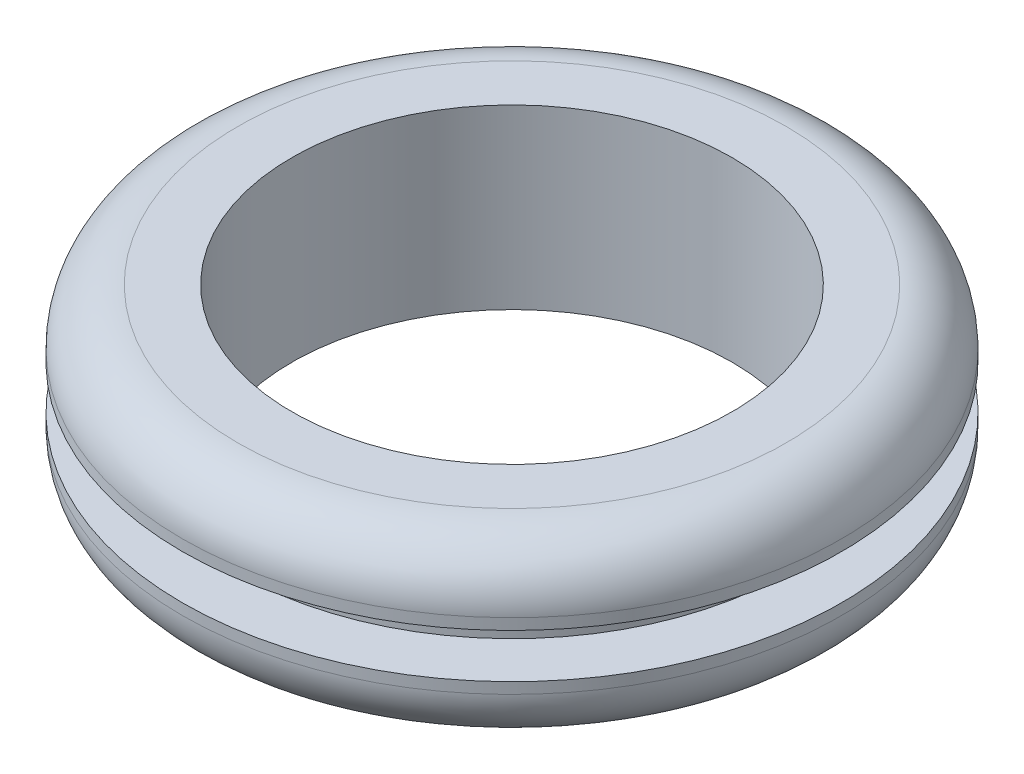
ISO-10303-21;
HEADER;
FILE_DESCRIPTION(('STEP AP214'),'2;1');
FILE_NAME('part.step','',(''),(''),'','','');
FILE_SCHEMA(('AUTOMOTIVE_DESIGN { 1 0 10303 214 1 1 1 1 }'));
ENDSEC;
DATA;
#1=APPLICATION_CONTEXT('core data for automotive mechanical design processes');
#2=APPLICATION_PROTOCOL_DEFINITION('international standard','automotive_design',2000,#1);
#3=PRODUCT_CONTEXT('',#1,'mechanical');
#4=PRODUCT('Part','Part','',(#3));
#5=PRODUCT_RELATED_PRODUCT_CATEGORY('part','',(#4));
#6=PRODUCT_DEFINITION_FORMATION('','',#4);
#7=PRODUCT_DEFINITION_CONTEXT('part definition',#1,'design');
#8=PRODUCT_DEFINITION('design','',#6,#7);
#9=PRODUCT_DEFINITION_SHAPE('','',#8);
#10=(LENGTH_UNIT() NAMED_UNIT(*) SI_UNIT(.MILLI.,.METRE.));
#11=(NAMED_UNIT(*) PLANE_ANGLE_UNIT() SI_UNIT($,.RADIAN.));
#12=(NAMED_UNIT(*) SI_UNIT($,.STERADIAN.) SOLID_ANGLE_UNIT());
#13=UNCERTAINTY_MEASURE_WITH_UNIT(LENGTH_MEASURE(1.E-05),#10,'distance_accuracy_value','');
#14=(GEOMETRIC_REPRESENTATION_CONTEXT(3) GLOBAL_UNCERTAINTY_ASSIGNED_CONTEXT((#13)) GLOBAL_UNIT_ASSIGNED_CONTEXT((#10,
#11,#12)) REPRESENTATION_CONTEXT('',''));
#15=CARTESIAN_POINT('',(0.,0.,0.));
#16=DIRECTION('',(0.,0.,1.));
#17=DIRECTION('',(1.,0.,0.));
#18=AXIS2_PLACEMENT_3D('',#15,#16,#17);
#19=CARTESIAN_POINT('',(9.89999999999999,3.2,0.));
#20=DIRECTION('',(0.,1.,0.));
#21=DIRECTION('',(0.,0.,1.));
#22=AXIS2_PLACEMENT_3D('',#19,#20,#21);
#23=PLANE('',#22);
#24=CARTESIAN_POINT('',(0.,3.2,0.));
#25=DIRECTION('',(0.,-1.,0.));
#26=DIRECTION('',(0.,0.,-1.));
#27=AXIS2_PLACEMENT_3D('',#24,#25,#26);
#28=CIRCLE('',#27,7.95);
#29=CARTESIAN_POINT('',(0.,3.2,-7.95));
#30=VERTEX_POINT('',#29);
#31=EDGE_CURVE('E10',#30,#30,#28,.T.);
#32=ORIENTED_EDGE('',*,*,#31,.T.);
#33=EDGE_LOOP('',(#32));
#34=FACE_BOUND('',#33,.T.);
#35=CARTESIAN_POINT('',(0.,3.2,0.));
#36=DIRECTION('',(0.,-1.,0.));
#37=DIRECTION('',(0.,0.,-1.));
#38=AXIS2_PLACEMENT_3D('',#35,#36,#37);
#39=CIRCLE('',#38,9.89999999999999);
#40=CARTESIAN_POINT('',(0.,3.2,-9.89999999999999));
#41=VERTEX_POINT('',#40);
#42=EDGE_CURVE('E50',#41,#41,#39,.T.);
#43=ORIENTED_EDGE('',*,*,#42,.F.);
#44=EDGE_LOOP('',(#43));
#45=FACE_BOUND('',#44,.T.);
#46=ADVANCED_FACE('F31',(#34,#45),#23,.T.);
#47=CARTESIAN_POINT('',(0.,0.,0.));
#48=DIRECTION('',(0.,-1.,0.));
#49=DIRECTION('',(0.,0.,-1.));
#50=AXIS2_PLACEMENT_3D('',#47,#48,#49);
#51=CYLINDRICAL_SURFACE('',#50,7.95);
#52=ORIENTED_EDGE('',*,*,#31,.F.);
#53=EDGE_LOOP('',(#52));
#54=FACE_BOUND('',#53,.T.);
#55=CARTESIAN_POINT('',(0.,-3.2,0.));
#56=DIRECTION('',(0.,-1.,0.));
#57=DIRECTION('',(0.,0.,-1.));
#58=AXIS2_PLACEMENT_3D('',#55,#56,#57);
#59=CIRCLE('',#58,7.95);
#60=CARTESIAN_POINT('',(0.,-3.2,-7.95));
#61=VERTEX_POINT('',#60);
#62=EDGE_CURVE('E53',#61,#61,#59,.T.);
#63=ORIENTED_EDGE('',*,*,#62,.T.);
#64=EDGE_LOOP('',(#63));
#65=FACE_BOUND('',#64,.T.);
#66=ADVANCED_FACE('F92',(#54,#65),#51,.F.);
#67=CARTESIAN_POINT('',(0.,0.,0.));
#68=DIRECTION('',(0.,-1.,0.));
#69=DIRECTION('',(0.,0.,-1.));
#70=AXIS2_PLACEMENT_3D('',#67,#68,#69);
#71=CYLINDRICAL_SURFACE('',#70,10.);
#72=CARTESIAN_POINT('',(0.,0.8,0.));
#73=DIRECTION('',(0.,-1.,0.));
#74=DIRECTION('',(0.,0.,-1.));
#75=AXIS2_PLACEMENT_3D('',#72,#73,#74);
#76=CIRCLE('',#75,10.);
#77=CARTESIAN_POINT('',(0.,0.8,-10.));
#78=VERTEX_POINT('',#77);
#79=EDGE_CURVE('E37',#78,#78,#76,.T.);
#80=ORIENTED_EDGE('',*,*,#79,.T.);
#81=EDGE_LOOP('',(#80));
#82=FACE_BOUND('',#81,.T.);
#83=CARTESIAN_POINT('',(0.,-0.8,0.));
#84=DIRECTION('',(0.,-1.,0.));
#85=DIRECTION('',(0.,0.,-1.));
#86=AXIS2_PLACEMENT_3D('',#83,#84,#85);
#87=CIRCLE('',#86,10.);
#88=CARTESIAN_POINT('',(0.,-0.8,-10.));
#89=VERTEX_POINT('',#88);
#90=EDGE_CURVE('E56',#89,#89,#87,.T.);
#91=ORIENTED_EDGE('',*,*,#90,.F.);
#92=EDGE_LOOP('',(#91));
#93=FACE_BOUND('',#92,.T.);
#94=ADVANCED_FACE('F89',(#82,#93),#71,.T.);
#95=CARTESIAN_POINT('',(10.,0.8,0.));
#96=DIRECTION('',(0.,-1.,0.));
#97=DIRECTION('',(0.,0.,-1.));
#98=AXIS2_PLACEMENT_3D('',#95,#96,#97);
#99=PLANE('',#98);
#100=CARTESIAN_POINT('',(0.,0.8,0.));
#101=DIRECTION('',(0.,-1.,0.));
#102=DIRECTION('',(0.,0.,-1.));
#103=AXIS2_PLACEMENT_3D('',#100,#101,#102);
#104=CIRCLE('',#103,11.9);
#105=CARTESIAN_POINT('',(0.,0.8,-11.9));
#106=VERTEX_POINT('',#105);
#107=EDGE_CURVE('E41',#106,#106,#104,.T.);
#108=ORIENTED_EDGE('',*,*,#107,.T.);
#109=EDGE_LOOP('',(#108));
#110=FACE_BOUND('',#109,.T.);
#111=ORIENTED_EDGE('',*,*,#79,.F.);
#112=EDGE_LOOP('',(#111));
#113=FACE_BOUND('',#112,.T.);
#114=ADVANCED_FACE('F91',(#110,#113),#99,.T.);
#115=CARTESIAN_POINT('',(0.,0.,0.));
#116=DIRECTION('',(0.,-1.,0.));
#117=DIRECTION('',(0.,0.,-1.));
#118=AXIS2_PLACEMENT_3D('',#115,#116,#117);
#119=CYLINDRICAL_SURFACE('',#118,11.9);
#120=CARTESIAN_POINT('',(0.,1.19999999999999,0.));
#121=DIRECTION('',(0.,-1.,0.));
#122=DIRECTION('',(0.,0.,-1.));
#123=AXIS2_PLACEMENT_3D('',#120,#121,#122);
#124=CIRCLE('',#123,11.9);
#125=CARTESIAN_POINT('',(0.,1.19999999999999,-11.9));
#126=VERTEX_POINT('',#125);
#127=EDGE_CURVE('E45',#126,#126,#124,.T.);
#128=ORIENTED_EDGE('',*,*,#127,.T.);
#129=EDGE_LOOP('',(#128));
#130=FACE_BOUND('',#129,.T.);
#131=ORIENTED_EDGE('',*,*,#107,.F.);
#132=EDGE_LOOP('',(#131));
#133=FACE_BOUND('',#132,.T.);
#134=ADVANCED_FACE('F98',(#130,#133),#119,.T.);
#135=CARTESIAN_POINT('',(0.,1.2,0.));
#136=DIRECTION('',(0.,-1.,0.));
#137=DIRECTION('',(0.,0.,-1.));
#138=AXIS2_PLACEMENT_3D('',#135,#136,#137);
#139=TOROIDAL_SURFACE('',#138,9.9,2.);
#140=ORIENTED_EDGE('',*,*,#42,.T.);
#141=EDGE_LOOP('',(#140));
#142=FACE_BOUND('',#141,.T.);
#143=ORIENTED_EDGE('',*,*,#127,.F.);
#144=EDGE_LOOP('',(#143));
#145=FACE_BOUND('',#144,.T.);
#146=ADVANCED_FACE('F108',(#142,#145),#139,.T.);
#147=CARTESIAN_POINT('',(9.89999999999999,-3.2,0.));
#148=DIRECTION('',(0.,-1.,0.));
#149=DIRECTION('',(0.,0.,1.));
#150=AXIS2_PLACEMENT_3D('',#147,#148,#149);
#151=PLANE('',#150);
#152=ORIENTED_EDGE('',*,*,#62,.F.);
#153=EDGE_LOOP('',(#152));
#154=FACE_BOUND('',#153,.T.);
#155=CARTESIAN_POINT('',(0.,-3.2,0.));
#156=DIRECTION('',(0.,-1.,0.));
#157=DIRECTION('',(0.,0.,-1.));
#158=AXIS2_PLACEMENT_3D('',#155,#156,#157);
#159=CIRCLE('',#158,9.89999999999999);
#160=CARTESIAN_POINT('',(0.,-3.2,-9.89999999999999));
#161=VERTEX_POINT('',#160);
#162=EDGE_CURVE('E65',#161,#161,#159,.T.);
#163=ORIENTED_EDGE('',*,*,#162,.T.);
#164=EDGE_LOOP('',(#163));
#165=FACE_BOUND('',#164,.T.);
#166=ADVANCED_FACE('F69',(#154,#165),#151,.T.);
#167=CARTESIAN_POINT('',(10.,-0.8,0.));
#168=DIRECTION('',(0.,1.,0.));
#169=DIRECTION('',(0.,0.,-1.));
#170=AXIS2_PLACEMENT_3D('',#167,#168,#169);
#171=PLANE('',#170);
#172=CARTESIAN_POINT('',(0.,-0.8,0.));
#173=DIRECTION('',(0.,-1.,0.));
#174=DIRECTION('',(0.,0.,-1.));
#175=AXIS2_PLACEMENT_3D('',#172,#173,#174);
#176=CIRCLE('',#175,11.9);
#177=CARTESIAN_POINT('',(0.,-0.8,-11.9));
#178=VERTEX_POINT('',#177);
#179=EDGE_CURVE('E59',#178,#178,#176,.T.);
#180=ORIENTED_EDGE('',*,*,#179,.F.);
#181=EDGE_LOOP('',(#180));
#182=FACE_BOUND('',#181,.T.);
#183=ORIENTED_EDGE('',*,*,#90,.T.);
#184=EDGE_LOOP('',(#183));
#185=FACE_BOUND('',#184,.T.);
#186=ADVANCED_FACE('F80',(#182,#185),#171,.T.);
#187=CARTESIAN_POINT('',(0.,0.,0.));
#188=DIRECTION('',(0.,1.,0.));
#189=DIRECTION('',(0.,0.,-1.));
#190=AXIS2_PLACEMENT_3D('',#187,#188,#189);
#191=CYLINDRICAL_SURFACE('',#190,11.9);
#192=CARTESIAN_POINT('',(0.,-1.19999999999999,0.));
#193=DIRECTION('',(0.,-1.,0.));
#194=DIRECTION('',(0.,0.,-1.));
#195=AXIS2_PLACEMENT_3D('',#192,#193,#194);
#196=CIRCLE('',#195,11.9);
#197=CARTESIAN_POINT('',(0.,-1.19999999999999,-11.9));
#198=VERTEX_POINT('',#197);
#199=EDGE_CURVE('E62',#198,#198,#196,.T.);
#200=ORIENTED_EDGE('',*,*,#199,.F.);
#201=EDGE_LOOP('',(#200));
#202=FACE_BOUND('',#201,.T.);
#203=ORIENTED_EDGE('',*,*,#179,.T.);
#204=EDGE_LOOP('',(#203));
#205=FACE_BOUND('',#204,.T.);
#206=ADVANCED_FACE('F74',(#202,#205),#191,.T.);
#207=CARTESIAN_POINT('',(0.,-1.2,0.));
#208=DIRECTION('',(0.,1.,0.));
#209=DIRECTION('',(0.,0.,-1.));
#210=AXIS2_PLACEMENT_3D('',#207,#208,#209);
#211=TOROIDAL_SURFACE('',#210,9.9,2.);
#212=ORIENTED_EDGE('',*,*,#162,.F.);
#213=EDGE_LOOP('',(#212));
#214=FACE_BOUND('',#213,.T.);
#215=ORIENTED_EDGE('',*,*,#199,.T.);
#216=EDGE_LOOP('',(#215));
#217=FACE_BOUND('',#216,.T.);
#218=ADVANCED_FACE('F71',(#214,#217),#211,.T.);
#219=CLOSED_SHELL('',(#46,#66,#94,#114,#134,#146,#166,#186,#206,#218));
#220=MANIFOLD_SOLID_BREP('B2',#219);
#221=ADVANCED_BREP_SHAPE_REPRESENTATION('',(#18,#220),#14);
#222=SHAPE_DEFINITION_REPRESENTATION(#9,#221);
ENDSEC;
END-ISO-10303-21;
